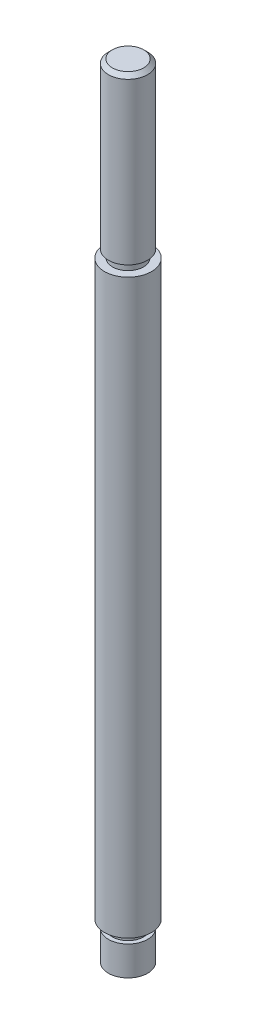
ISO-10303-21;
HEADER;
FILE_DESCRIPTION(('STEP AP214'),'2;1');
FILE_NAME('part.step','',(''),(''),'','','');
FILE_SCHEMA(('AUTOMOTIVE_DESIGN { 1 0 10303 214 1 1 1 1 }'));
ENDSEC;
DATA;
#1=APPLICATION_CONTEXT('core data for automotive mechanical design processes');
#2=APPLICATION_PROTOCOL_DEFINITION('international standard','automotive_design',2000,#1);
#3=PRODUCT_CONTEXT('',#1,'mechanical');
#4=PRODUCT('Part','Part','',(#3));
#5=PRODUCT_RELATED_PRODUCT_CATEGORY('part','',(#4));
#6=PRODUCT_DEFINITION_FORMATION('','',#4);
#7=PRODUCT_DEFINITION_CONTEXT('part definition',#1,'design');
#8=PRODUCT_DEFINITION('design','',#6,#7);
#9=PRODUCT_DEFINITION_SHAPE('','',#8);
#10=(LENGTH_UNIT() NAMED_UNIT(*) SI_UNIT(.MILLI.,.METRE.));
#11=(NAMED_UNIT(*) PLANE_ANGLE_UNIT() SI_UNIT($,.RADIAN.));
#12=(NAMED_UNIT(*) SI_UNIT($,.STERADIAN.) SOLID_ANGLE_UNIT());
#13=UNCERTAINTY_MEASURE_WITH_UNIT(LENGTH_MEASURE(1.E-05),#10,'distance_accuracy_value','');
#14=(GEOMETRIC_REPRESENTATION_CONTEXT(3) GLOBAL_UNCERTAINTY_ASSIGNED_CONTEXT((#13)) GLOBAL_UNIT_ASSIGNED_CONTEXT((#10,
#11,#12)) REPRESENTATION_CONTEXT('',''));
#15=CARTESIAN_POINT('',(0.,0.,0.));
#16=DIRECTION('',(0.,0.,1.));
#17=DIRECTION('',(1.,0.,0.));
#18=AXIS2_PLACEMENT_3D('',#15,#16,#17);
#19=CARTESIAN_POINT('',(0.,0.,0.));
#20=DIRECTION('',(0.,-1.,0.));
#21=DIRECTION('',(0.,0.,-1.));
#22=AXIS2_PLACEMENT_3D('',#19,#20,#21);
#23=PLANE('',#22);
#24=CARTESIAN_POINT('',(0.,0.,0.));
#25=DIRECTION('',(0.,-1.,0.));
#26=DIRECTION('',(0.,0.,-1.));
#27=AXIS2_PLACEMENT_3D('',#24,#25,#26);
#28=CIRCLE('',#27,5.);
#29=CARTESIAN_POINT('',(0.,0.,-5.));
#30=VERTEX_POINT('',#29);
#31=EDGE_CURVE('E42',#30,#30,#28,.T.);
#32=ORIENTED_EDGE('',*,*,#31,.T.);
#33=EDGE_LOOP('',(#32));
#34=FACE_BOUND('',#33,.T.);
#35=ADVANCED_FACE('F31',(#34),#23,.T.);
#36=CARTESIAN_POINT('',(0.,0.,0.));
#37=DIRECTION('',(0.,-1.,0.));
#38=DIRECTION('',(0.,0.,-1.));
#39=AXIS2_PLACEMENT_3D('',#36,#37,#38);
#40=CYLINDRICAL_SURFACE('',#39,5.);
#41=CARTESIAN_POINT('',(0.,7.5,0.));
#42=DIRECTION('',(0.,-1.,0.));
#43=DIRECTION('',(0.,0.,-1.));
#44=AXIS2_PLACEMENT_3D('',#41,#42,#43);
#45=CIRCLE('',#44,5.);
#46=CARTESIAN_POINT('',(0.,7.5,-5.));
#47=VERTEX_POINT('',#46);
#48=EDGE_CURVE('E46',#47,#47,#45,.T.);
#49=ORIENTED_EDGE('',*,*,#48,.T.);
#50=EDGE_LOOP('',(#49));
#51=FACE_BOUND('',#50,.T.);
#52=ORIENTED_EDGE('',*,*,#31,.F.);
#53=EDGE_LOOP('',(#52));
#54=FACE_BOUND('',#53,.T.);
#55=ADVANCED_FACE('F88',(#51,#54),#40,.T.);
#56=CARTESIAN_POINT('',(3.95,7.5,0.));
#57=DIRECTION('',(0.,1.,0.));
#58=DIRECTION('',(0.,0.,1.));
#59=AXIS2_PLACEMENT_3D('',#56,#57,#58);
#60=PLANE('',#59);
#61=CARTESIAN_POINT('',(0.,7.5,0.));
#62=DIRECTION('',(0.,-1.,0.));
#63=DIRECTION('',(0.,0.,-1.));
#64=AXIS2_PLACEMENT_3D('',#61,#62,#63);
#65=CIRCLE('',#64,3.95);
#66=CARTESIAN_POINT('',(0.,7.5,-3.95));
#67=VERTEX_POINT('',#66);
#68=EDGE_CURVE('E51',#67,#67,#65,.T.);
#69=ORIENTED_EDGE('',*,*,#68,.T.);
#70=EDGE_LOOP('',(#69));
#71=FACE_BOUND('',#70,.T.);
#72=ORIENTED_EDGE('',*,*,#48,.F.);
#73=EDGE_LOOP('',(#72));
#74=FACE_BOUND('',#73,.T.);
#75=ADVANCED_FACE('F93',(#71,#74),#60,.T.);
#76=CARTESIAN_POINT('',(0.,0.,0.));
#77=DIRECTION('',(0.,-1.,0.));
#78=DIRECTION('',(0.,0.,-1.));
#79=AXIS2_PLACEMENT_3D('',#76,#77,#78);
#80=CYLINDRICAL_SURFACE('',#79,3.95);
#81=CARTESIAN_POINT('',(0.,9.5,0.));
#82=DIRECTION('',(0.,-1.,0.));
#83=DIRECTION('',(0.,0.,-1.));
#84=AXIS2_PLACEMENT_3D('',#81,#82,#83);
#85=CIRCLE('',#84,3.95);
#86=CARTESIAN_POINT('',(0.,9.5,-3.95));
#87=VERTEX_POINT('',#86);
#88=EDGE_CURVE('E54',#87,#87,#85,.T.);
#89=ORIENTED_EDGE('',*,*,#88,.T.);
#90=EDGE_LOOP('',(#89));
#91=FACE_BOUND('',#90,.T.);
#92=ORIENTED_EDGE('',*,*,#68,.F.);
#93=EDGE_LOOP('',(#92));
#94=FACE_BOUND('',#93,.T.);
#95=ADVANCED_FACE('F99',(#91,#94),#80,.T.);
#96=CARTESIAN_POINT('',(3.95,9.5,0.));
#97=DIRECTION('',(0.,-1.,0.));
#98=DIRECTION('',(0.,0.,-1.));
#99=AXIS2_PLACEMENT_3D('',#96,#97,#98);
#100=PLANE('',#99);
#101=CARTESIAN_POINT('',(0.,9.5,0.));
#102=DIRECTION('',(0.,-1.,0.));
#103=DIRECTION('',(0.,0.,-1.));
#104=AXIS2_PLACEMENT_3D('',#101,#102,#103);
#105=CIRCLE('',#104,6.);
#106=CARTESIAN_POINT('',(0.,9.5,-6.));
#107=VERTEX_POINT('',#106);
#108=EDGE_CURVE('E57',#107,#107,#105,.T.);
#109=ORIENTED_EDGE('',*,*,#108,.T.);
#110=EDGE_LOOP('',(#109));
#111=FACE_BOUND('',#110,.T.);
#112=ORIENTED_EDGE('',*,*,#88,.F.);
#113=EDGE_LOOP('',(#112));
#114=FACE_BOUND('',#113,.T.);
#115=ADVANCED_FACE('F103',(#111,#114),#100,.T.);
#116=CARTESIAN_POINT('',(0.,0.,0.));
#117=DIRECTION('',(0.,-1.,0.));
#118=DIRECTION('',(0.,0.,-1.));
#119=AXIS2_PLACEMENT_3D('',#116,#117,#118);
#120=CYLINDRICAL_SURFACE('',#119,6.);
#121=CARTESIAN_POINT('',(0.,155.5,0.));
#122=DIRECTION('',(0.,-1.,0.));
#123=DIRECTION('',(0.,0.,-1.));
#124=AXIS2_PLACEMENT_3D('',#121,#122,#123);
#125=CIRCLE('',#124,6.);
#126=CARTESIAN_POINT('',(0.,155.5,-6.));
#127=VERTEX_POINT('',#126);
#128=EDGE_CURVE('E60',#127,#127,#125,.T.);
#129=ORIENTED_EDGE('',*,*,#128,.T.);
#130=EDGE_LOOP('',(#129));
#131=FACE_BOUND('',#130,.T.);
#132=ORIENTED_EDGE('',*,*,#108,.F.);
#133=EDGE_LOOP('',(#132));
#134=FACE_BOUND('',#133,.T.);
#135=ADVANCED_FACE('F107',(#131,#134),#120,.T.);
#136=CARTESIAN_POINT('',(6.,155.5,0.));
#137=DIRECTION('',(0.,1.,0.));
#138=DIRECTION('',(0.,0.,1.));
#139=AXIS2_PLACEMENT_3D('',#136,#137,#138);
#140=PLANE('',#139);
#141=CARTESIAN_POINT('',(0.,155.5,0.));
#142=DIRECTION('',(0.,-1.,0.));
#143=DIRECTION('',(0.,0.,-1.));
#144=AXIS2_PLACEMENT_3D('',#141,#142,#143);
#145=CIRCLE('',#144,3.94999999999996);
#146=CARTESIAN_POINT('',(0.,155.5,-3.94999999999996));
#147=VERTEX_POINT('',#146);
#148=EDGE_CURVE('E63',#147,#147,#145,.T.);
#149=ORIENTED_EDGE('',*,*,#148,.T.);
#150=EDGE_LOOP('',(#149));
#151=FACE_BOUND('',#150,.T.);
#152=ORIENTED_EDGE('',*,*,#128,.F.);
#153=EDGE_LOOP('',(#152));
#154=FACE_BOUND('',#153,.T.);
#155=ADVANCED_FACE('F111',(#151,#154),#140,.T.);
#156=CARTESIAN_POINT('',(0.,0.,0.));
#157=DIRECTION('',(0.,-1.,0.));
#158=DIRECTION('',(0.,0.,-1.));
#159=AXIS2_PLACEMENT_3D('',#156,#157,#158);
#160=CYLINDRICAL_SURFACE('',#159,3.94999999999996);
#161=CARTESIAN_POINT('',(0.,157.5,0.));
#162=DIRECTION('',(0.,-1.,0.));
#163=DIRECTION('',(0.,0.,-1.));
#164=AXIS2_PLACEMENT_3D('',#161,#162,#163);
#165=CIRCLE('',#164,3.94999999999996);
#166=CARTESIAN_POINT('',(0.,157.5,-3.94999999999996));
#167=VERTEX_POINT('',#166);
#168=EDGE_CURVE('E66',#167,#167,#165,.T.);
#169=ORIENTED_EDGE('',*,*,#168,.T.);
#170=EDGE_LOOP('',(#169));
#171=FACE_BOUND('',#170,.T.);
#172=ORIENTED_EDGE('',*,*,#148,.F.);
#173=EDGE_LOOP('',(#172));
#174=FACE_BOUND('',#173,.T.);
#175=ADVANCED_FACE('F85',(#171,#174),#160,.T.);
#176=CARTESIAN_POINT('',(3.94999999999996,157.5,0.));
#177=DIRECTION('',(0.,-1.,0.));
#178=DIRECTION('',(0.,0.,-1.));
#179=AXIS2_PLACEMENT_3D('',#176,#177,#178);
#180=PLANE('',#179);
#181=CARTESIAN_POINT('',(0.,157.5,0.));
#182=DIRECTION('',(0.,-1.,0.));
#183=DIRECTION('',(0.,0.,-1.));
#184=AXIS2_PLACEMENT_3D('',#181,#182,#183);
#185=CIRCLE('',#184,5.);
#186=CARTESIAN_POINT('',(0.,157.5,-5.));
#187=VERTEX_POINT('',#186);
#188=EDGE_CURVE('E69',#187,#187,#185,.T.);
#189=ORIENTED_EDGE('',*,*,#188,.T.);
#190=EDGE_LOOP('',(#189));
#191=FACE_BOUND('',#190,.T.);
#192=ORIENTED_EDGE('',*,*,#168,.F.);
#193=EDGE_LOOP('',(#192));
#194=FACE_BOUND('',#193,.T.);
#195=ADVANCED_FACE('F73',(#191,#194),#180,.T.);
#196=CARTESIAN_POINT('',(0.,0.,0.));
#197=DIRECTION('',(0.,-1.,0.));
#198=DIRECTION('',(0.,0.,-1.));
#199=AXIS2_PLACEMENT_3D('',#196,#197,#198);
#200=CYLINDRICAL_SURFACE('',#199,5.);
#201=CARTESIAN_POINT('',(0.,198.5,0.));
#202=DIRECTION('',(0.,1.,0.));
#203=DIRECTION('',(0.,0.,1.));
#204=AXIS2_PLACEMENT_3D('',#201,#202,#203);
#205=CIRCLE('',#204,5.);
#206=CARTESIAN_POINT('',(0.,198.5,5.));
#207=VERTEX_POINT('',#206);
#208=EDGE_CURVE('E38',#207,#207,#205,.F.);
#209=ORIENTED_EDGE('',*,*,#208,.T.);
#210=EDGE_LOOP('',(#209));
#211=FACE_BOUND('',#210,.T.);
#212=ORIENTED_EDGE('',*,*,#188,.F.);
#213=EDGE_LOOP('',(#212));
#214=FACE_BOUND('',#213,.T.);
#215=ADVANCED_FACE('F76',(#211,#214),#200,.T.);
#216=CARTESIAN_POINT('',(5.,199.5,0.));
#217=DIRECTION('',(0.,1.,0.));
#218=DIRECTION('',(0.,0.,1.));
#219=AXIS2_PLACEMENT_3D('',#216,#217,#218);
#220=PLANE('',#219);
#221=CARTESIAN_POINT('',(0.,199.5,0.));
#222=DIRECTION('',(0.,1.,0.));
#223=DIRECTION('',(0.,0.,1.));
#224=AXIS2_PLACEMENT_3D('',#221,#222,#223);
#225=CIRCLE('',#224,4.00000000000006);
#226=CARTESIAN_POINT('',(0.,199.5,4.00000000000006));
#227=VERTEX_POINT('',#226);
#228=EDGE_CURVE('E10',#227,#227,#225,.T.);
#229=ORIENTED_EDGE('',*,*,#228,.T.);
#230=EDGE_LOOP('',(#229));
#231=FACE_BOUND('',#230,.T.);
#232=ADVANCED_FACE('F78',(#231),#220,.T.);
#233=CARTESIAN_POINT('',(0.,198.5,0.));
#234=DIRECTION('',(0.,-1.,0.));
#235=DIRECTION('',(0.,0.,-1.));
#236=AXIS2_PLACEMENT_3D('',#233,#234,#235);
#237=CONICAL_SURFACE('',#236,5.,0.785398163397447);
#238=ORIENTED_EDGE('',*,*,#228,.F.);
#239=EDGE_LOOP('',(#238));
#240=FACE_BOUND('',#239,.T.);
#241=ORIENTED_EDGE('',*,*,#208,.F.);
#242=EDGE_LOOP('',(#241));
#243=FACE_BOUND('',#242,.T.);
#244=ADVANCED_FACE('F33',(#240,#243),#237,.T.);
#245=CLOSED_SHELL('',(#35,#55,#75,#95,#115,#135,#155,#175,#195,#215,#232,#244));
#246=MANIFOLD_SOLID_BREP('B2',#245);
#247=ADVANCED_BREP_SHAPE_REPRESENTATION('',(#18,#246),#14);
#248=SHAPE_DEFINITION_REPRESENTATION(#9,#247);
ENDSEC;
END-ISO-10303-21;
